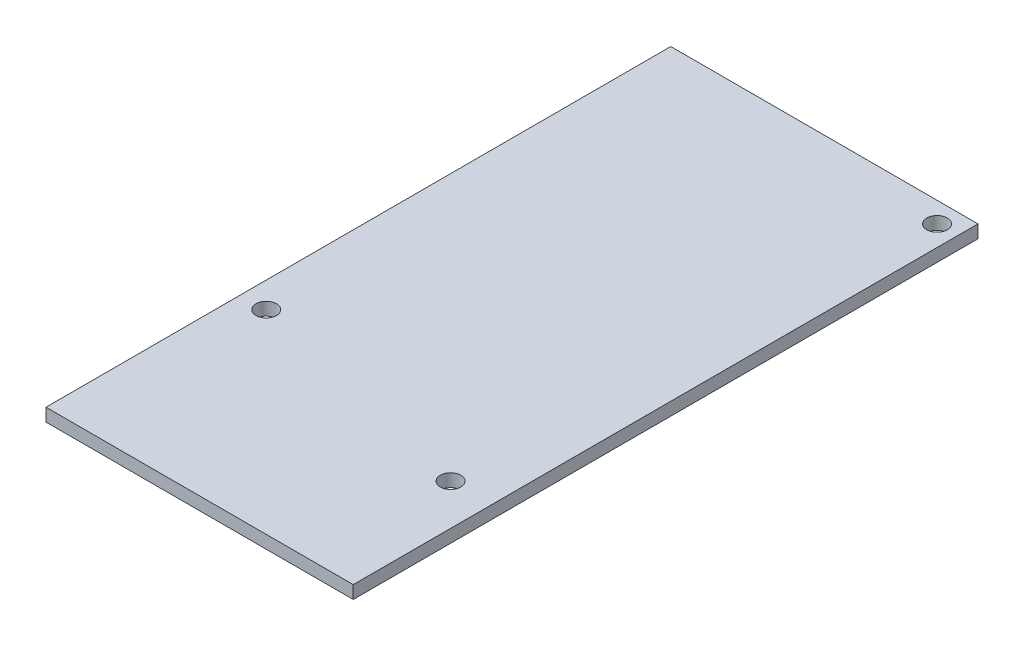
ISO-10303-21;
HEADER;
FILE_DESCRIPTION(('STEP AP214'),'2;1');
FILE_NAME('part.step','',(''),(''),'','','');
FILE_SCHEMA(('AUTOMOTIVE_DESIGN { 1 0 10303 214 1 1 1 1 }'));
ENDSEC;
DATA;
#1=APPLICATION_CONTEXT('core data for automotive mechanical design processes');
#2=APPLICATION_PROTOCOL_DEFINITION('international standard','automotive_design',2000,#1);
#3=PRODUCT_CONTEXT('',#1,'mechanical');
#4=PRODUCT('Part','Part','',(#3));
#5=PRODUCT_RELATED_PRODUCT_CATEGORY('part','',(#4));
#6=PRODUCT_DEFINITION_FORMATION('','',#4);
#7=PRODUCT_DEFINITION_CONTEXT('part definition',#1,'design');
#8=PRODUCT_DEFINITION('design','',#6,#7);
#9=PRODUCT_DEFINITION_SHAPE('','',#8);
#10=(LENGTH_UNIT() NAMED_UNIT(*) SI_UNIT(.MILLI.,.METRE.));
#11=(NAMED_UNIT(*) PLANE_ANGLE_UNIT() SI_UNIT($,.RADIAN.));
#12=(NAMED_UNIT(*) SI_UNIT($,.STERADIAN.) SOLID_ANGLE_UNIT());
#13=UNCERTAINTY_MEASURE_WITH_UNIT(LENGTH_MEASURE(1.E-05),#10,'distance_accuracy_value','');
#14=(GEOMETRIC_REPRESENTATION_CONTEXT(3) GLOBAL_UNCERTAINTY_ASSIGNED_CONTEXT((#13)) GLOBAL_UNIT_ASSIGNED_CONTEXT((#10,
#11,#12)) REPRESENTATION_CONTEXT('',''));
#15=CARTESIAN_POINT('',(0.,0.,0.));
#16=DIRECTION('',(0.,0.,1.));
#17=DIRECTION('',(1.,0.,0.));
#18=AXIS2_PLACEMENT_3D('',#15,#16,#17);
#19=CARTESIAN_POINT('',(19.05,1.6,-63.495));
#20=DIRECTION('',(-1.,0.,0.));
#21=DIRECTION('',(0.,0.,1.));
#22=AXIS2_PLACEMENT_3D('',#19,#20,#21);
#23=PLANE('',#22);
#24=DIRECTION('',(0.,0.,-1.));
#25=VECTOR('',#24,1.);
#26=CARTESIAN_POINT('',(19.05,0.,-63.495));
#27=LINE('',#26,#25);
#28=CARTESIAN_POINT('',(19.05,0.,30.485));
#29=VERTEX_POINT('',#28);
#30=CARTESIAN_POINT('',(19.05,0.,-46.99));
#31=VERTEX_POINT('',#30);
#32=EDGE_CURVE('E39',#29,#31,#27,.T.);
#33=ORIENTED_EDGE('',*,*,#32,.T.);
#34=DIRECTION('',(0.,-1.,0.));
#35=VECTOR('',#34,1.);
#36=CARTESIAN_POINT('',(19.05,1.6,-46.99));
#37=LINE('',#36,#35);
#38=CARTESIAN_POINT('',(19.05,1.6,-46.99));
#39=VERTEX_POINT('',#38);
#40=EDGE_CURVE('E95',#39,#31,#37,.T.);
#41=ORIENTED_EDGE('',*,*,#40,.F.);
#42=DIRECTION('',(0.,0.,-1.));
#43=VECTOR('',#42,1.);
#44=CARTESIAN_POINT('',(19.05,1.6,-63.495));
#45=LINE('',#44,#43);
#46=CARTESIAN_POINT('',(19.05,1.6,30.485));
#47=VERTEX_POINT('',#46);
#48=EDGE_CURVE('E109',#47,#39,#45,.T.);
#49=ORIENTED_EDGE('',*,*,#48,.F.);
#50=DIRECTION('',(0.,-1.,0.));
#51=VECTOR('',#50,1.);
#52=CARTESIAN_POINT('',(19.05,1.6,30.485));
#53=LINE('',#52,#51);
#54=EDGE_CURVE('E89',#47,#29,#53,.T.);
#55=ORIENTED_EDGE('',*,*,#54,.T.);
#56=EDGE_LOOP('',(#33,#41,#49,#55));
#57=FACE_BOUND('',#56,.T.);
#58=ADVANCED_FACE('F36',(#57),#23,.F.);
#59=CARTESIAN_POINT('',(-19.05,1.6,-63.495));
#60=DIRECTION('',(1.,0.,0.));
#61=DIRECTION('',(0.,0.,-1.));
#62=AXIS2_PLACEMENT_3D('',#59,#60,#61);
#63=PLANE('',#62);
#64=DIRECTION('',(0.,0.,1.));
#65=VECTOR('',#64,1.);
#66=CARTESIAN_POINT('',(-19.05,1.6,-63.495));
#67=LINE('',#66,#65);
#68=CARTESIAN_POINT('',(-19.05,1.6,-46.99));
#69=VERTEX_POINT('',#68);
#70=CARTESIAN_POINT('',(-19.05,1.6,30.485));
#71=VERTEX_POINT('',#70);
#72=EDGE_CURVE('E73',#69,#71,#67,.T.);
#73=ORIENTED_EDGE('',*,*,#72,.F.);
#74=DIRECTION('',(0.,-1.,0.));
#75=VECTOR('',#74,1.);
#76=CARTESIAN_POINT('',(-19.05,1.6,-46.99));
#77=LINE('',#76,#75);
#78=CARTESIAN_POINT('',(-19.05,0.,-46.99));
#79=VERTEX_POINT('',#78);
#80=EDGE_CURVE('E94',#69,#79,#77,.T.);
#81=ORIENTED_EDGE('',*,*,#80,.T.);
#82=DIRECTION('',(0.,0.,1.));
#83=VECTOR('',#82,1.);
#84=CARTESIAN_POINT('',(-19.05,0.,-63.495));
#85=LINE('',#84,#83);
#86=CARTESIAN_POINT('',(-19.05,0.,30.485));
#87=VERTEX_POINT('',#86);
#88=EDGE_CURVE('E68',#79,#87,#85,.T.);
#89=ORIENTED_EDGE('',*,*,#88,.T.);
#90=DIRECTION('',(0.,-1.,0.));
#91=VECTOR('',#90,1.);
#92=CARTESIAN_POINT('',(-19.05,1.6,30.485));
#93=LINE('',#92,#91);
#94=EDGE_CURVE('E45',#71,#87,#93,.T.);
#95=ORIENTED_EDGE('',*,*,#94,.F.);
#96=EDGE_LOOP('',(#73,#81,#89,#95));
#97=FACE_BOUND('',#96,.T.);
#98=ADVANCED_FACE('F99',(#97),#63,.F.);
#99=CARTESIAN_POINT('',(0.,1.6,-16.505));
#100=DIRECTION('',(0.,1.,0.));
#101=DIRECTION('',(0.,0.,1.));
#102=AXIS2_PLACEMENT_3D('',#99,#100,#101);
#103=PLANE('',#102);
#104=ORIENTED_EDGE('',*,*,#48,.T.);
#105=DIRECTION('',(-1.,0.,0.));
#106=VECTOR('',#105,1.);
#107=CARTESIAN_POINT('',(-19.05,1.6,-46.99));
#108=LINE('',#107,#106);
#109=EDGE_CURVE('E96',#39,#69,#108,.T.);
#110=ORIENTED_EDGE('',*,*,#109,.T.);
#111=ORIENTED_EDGE('',*,*,#72,.T.);
#112=DIRECTION('',(1.,0.,0.));
#113=VECTOR('',#112,1.);
#114=CARTESIAN_POINT('',(-19.05,1.6,30.485));
#115=LINE('',#114,#113);
#116=EDGE_CURVE('E108',#71,#47,#115,.T.);
#117=ORIENTED_EDGE('',*,*,#116,.T.);
#118=EDGE_LOOP('',(#104,#110,#111,#117));
#119=FACE_BOUND('',#118,.T.);
#120=CARTESIAN_POINT('',(13.97,1.6,13.335));
#121=DIRECTION('',(0.,1.,0.));
#122=DIRECTION('',(0.,0.,1.));
#123=AXIS2_PLACEMENT_3D('',#120,#121,#122);
#124=CIRCLE('',#123,1.27);
#125=CARTESIAN_POINT('',(13.97,1.6,14.605));
#126=VERTEX_POINT('',#125);
#127=EDGE_CURVE('E11',#126,#126,#124,.T.);
#128=ORIENTED_EDGE('',*,*,#127,.F.);
#129=EDGE_LOOP('',(#128));
#130=FACE_BOUND('',#129,.T.);
#131=CARTESIAN_POINT('',(-15.875,1.6,6.35));
#132=DIRECTION('',(0.,1.,0.));
#133=DIRECTION('',(0.,0.,1.));
#134=AXIS2_PLACEMENT_3D('',#131,#132,#133);
#135=CIRCLE('',#134,1.27);
#136=CARTESIAN_POINT('',(-15.875,1.6,7.62));
#137=VERTEX_POINT('',#136);
#138=EDGE_CURVE('E97',#137,#137,#135,.T.);
#139=ORIENTED_EDGE('',*,*,#138,.F.);
#140=EDGE_LOOP('',(#139));
#141=FACE_BOUND('',#140,.T.);
#142=CARTESIAN_POINT('',(16.51,1.6,-44.45));
#143=DIRECTION('',(0.,1.,0.));
#144=DIRECTION('',(0.,0.,1.));
#145=AXIS2_PLACEMENT_3D('',#142,#143,#144);
#146=CIRCLE('',#145,1.27);
#147=CARTESIAN_POINT('',(16.51,1.6,-43.18));
#148=VERTEX_POINT('',#147);
#149=EDGE_CURVE('E155',#148,#148,#146,.T.);
#150=ORIENTED_EDGE('',*,*,#149,.F.);
#151=EDGE_LOOP('',(#150));
#152=FACE_BOUND('',#151,.T.);
#153=ADVANCED_FACE('F116',(#119,#130,#141,#152),#103,.T.);
#154=CARTESIAN_POINT('',(0.,0.,-16.505));
#155=DIRECTION('',(0.,1.,0.));
#156=DIRECTION('',(0.,0.,1.));
#157=AXIS2_PLACEMENT_3D('',#154,#155,#156);
#158=PLANE('',#157);
#159=CARTESIAN_POINT('',(13.97,0.,13.335));
#160=DIRECTION('',(0.,1.,0.));
#161=DIRECTION('',(0.,0.,1.));
#162=AXIS2_PLACEMENT_3D('',#159,#160,#161);
#163=CIRCLE('',#162,1.27);
#164=CARTESIAN_POINT('',(13.97,0.,14.605));
#165=VERTEX_POINT('',#164);
#166=EDGE_CURVE('E107',#165,#165,#163,.T.);
#167=ORIENTED_EDGE('',*,*,#166,.T.);
#168=EDGE_LOOP('',(#167));
#169=FACE_BOUND('',#168,.T.);
#170=ORIENTED_EDGE('',*,*,#88,.F.);
#171=DIRECTION('',(-1.,0.,0.));
#172=VECTOR('',#171,1.);
#173=CARTESIAN_POINT('',(-19.05,0.,-46.99));
#174=LINE('',#173,#172);
#175=EDGE_CURVE('E87',#31,#79,#174,.T.);
#176=ORIENTED_EDGE('',*,*,#175,.F.);
#177=ORIENTED_EDGE('',*,*,#32,.F.);
#178=DIRECTION('',(1.,0.,0.));
#179=VECTOR('',#178,1.);
#180=CARTESIAN_POINT('',(-19.05,0.,30.485));
#181=LINE('',#180,#179);
#182=EDGE_CURVE('E54',#87,#29,#181,.T.);
#183=ORIENTED_EDGE('',*,*,#182,.F.);
#184=EDGE_LOOP('',(#170,#176,#177,#183));
#185=FACE_BOUND('',#184,.T.);
#186=CARTESIAN_POINT('',(-15.875,0.,6.35));
#187=DIRECTION('',(0.,1.,0.));
#188=DIRECTION('',(0.,0.,1.));
#189=AXIS2_PLACEMENT_3D('',#186,#187,#188);
#190=CIRCLE('',#189,1.27);
#191=CARTESIAN_POINT('',(-15.875,0.,7.62));
#192=VERTEX_POINT('',#191);
#193=EDGE_CURVE('E154',#192,#192,#190,.T.);
#194=ORIENTED_EDGE('',*,*,#193,.T.);
#195=EDGE_LOOP('',(#194));
#196=FACE_BOUND('',#195,.T.);
#197=CARTESIAN_POINT('',(16.51,0.,-44.45));
#198=DIRECTION('',(0.,1.,0.));
#199=DIRECTION('',(0.,0.,1.));
#200=AXIS2_PLACEMENT_3D('',#197,#198,#199);
#201=CIRCLE('',#200,1.27);
#202=CARTESIAN_POINT('',(16.51,0.,-43.18));
#203=VERTEX_POINT('',#202);
#204=EDGE_CURVE('E156',#203,#203,#201,.T.);
#205=ORIENTED_EDGE('',*,*,#204,.T.);
#206=EDGE_LOOP('',(#205));
#207=FACE_BOUND('',#206,.T.);
#208=ADVANCED_FACE('F85',(#169,#185,#196,#207),#158,.F.);
#209=CARTESIAN_POINT('',(-19.05,1.6,30.485));
#210=DIRECTION('',(0.,0.,-1.));
#211=DIRECTION('',(-1.,0.,0.));
#212=AXIS2_PLACEMENT_3D('',#209,#210,#211);
#213=PLANE('',#212);
#214=ORIENTED_EDGE('',*,*,#182,.T.);
#215=ORIENTED_EDGE('',*,*,#54,.F.);
#216=ORIENTED_EDGE('',*,*,#116,.F.);
#217=ORIENTED_EDGE('',*,*,#94,.T.);
#218=EDGE_LOOP('',(#214,#215,#216,#217));
#219=FACE_BOUND('',#218,.T.);
#220=ADVANCED_FACE('F129',(#219),#213,.F.);
#221=CARTESIAN_POINT('',(13.97,0.,13.335));
#222=DIRECTION('',(0.,1.,0.));
#223=DIRECTION('',(0.,0.,1.));
#224=AXIS2_PLACEMENT_3D('',#221,#222,#223);
#225=CYLINDRICAL_SURFACE('',#224,1.27);
#226=ORIENTED_EDGE('',*,*,#127,.T.);
#227=EDGE_LOOP('',(#226));
#228=FACE_BOUND('',#227,.T.);
#229=ORIENTED_EDGE('',*,*,#166,.F.);
#230=EDGE_LOOP('',(#229));
#231=FACE_BOUND('',#230,.T.);
#232=ADVANCED_FACE('F132',(#228,#231),#225,.F.);
#233=CARTESIAN_POINT('',(-19.05,1.6,-46.99));
#234=DIRECTION('',(0.,0.,1.));
#235=DIRECTION('',(1.,0.,0.));
#236=AXIS2_PLACEMENT_3D('',#233,#234,#235);
#237=PLANE('',#236);
#238=ORIENTED_EDGE('',*,*,#175,.T.);
#239=ORIENTED_EDGE('',*,*,#80,.F.);
#240=ORIENTED_EDGE('',*,*,#109,.F.);
#241=ORIENTED_EDGE('',*,*,#40,.T.);
#242=EDGE_LOOP('',(#238,#239,#240,#241));
#243=FACE_BOUND('',#242,.T.);
#244=ADVANCED_FACE('F92',(#243),#237,.F.);
#245=CARTESIAN_POINT('',(16.51,0.,-44.45));
#246=DIRECTION('',(0.,1.,0.));
#247=DIRECTION('',(0.,0.,1.));
#248=AXIS2_PLACEMENT_3D('',#245,#246,#247);
#249=CYLINDRICAL_SURFACE('',#248,1.27);
#250=ORIENTED_EDGE('',*,*,#149,.T.);
#251=EDGE_LOOP('',(#250));
#252=FACE_BOUND('',#251,.T.);
#253=ORIENTED_EDGE('',*,*,#204,.F.);
#254=EDGE_LOOP('',(#253));
#255=FACE_BOUND('',#254,.T.);
#256=ADVANCED_FACE('F140',(#252,#255),#249,.F.);
#257=CARTESIAN_POINT('',(-15.875,0.,6.35));
#258=DIRECTION('',(0.,1.,0.));
#259=DIRECTION('',(0.,0.,1.));
#260=AXIS2_PLACEMENT_3D('',#257,#258,#259);
#261=CYLINDRICAL_SURFACE('',#260,1.27);
#262=ORIENTED_EDGE('',*,*,#138,.T.);
#263=EDGE_LOOP('',(#262));
#264=FACE_BOUND('',#263,.T.);
#265=ORIENTED_EDGE('',*,*,#193,.F.);
#266=EDGE_LOOP('',(#265));
#267=FACE_BOUND('',#266,.T.);
#268=ADVANCED_FACE('F143',(#264,#267),#261,.F.);
#269=CLOSED_SHELL('',(#58,#98,#153,#208,#220,#232,#244,#256,#268));
#270=MANIFOLD_SOLID_BREP('B2',#269);
#271=ADVANCED_BREP_SHAPE_REPRESENTATION('',(#18,#270),#14);
#272=SHAPE_DEFINITION_REPRESENTATION(#9,#271);
ENDSEC;
END-ISO-10303-21;
